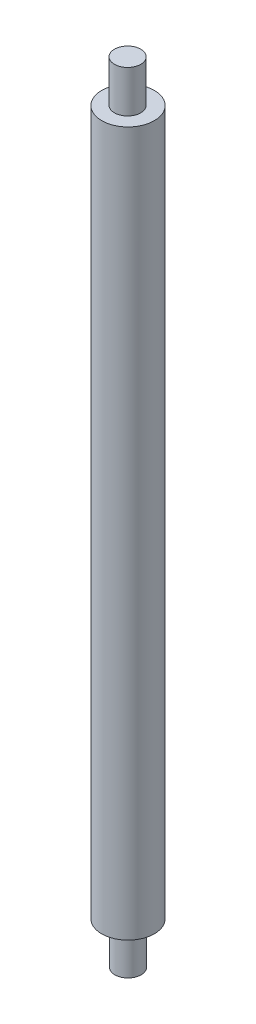
ISO-10303-21;
HEADER;
FILE_DESCRIPTION(('STEP AP214'),'2;1');
FILE_NAME('part.step','',(''),(''),'','','');
FILE_SCHEMA(('AUTOMOTIVE_DESIGN { 1 0 10303 214 1 1 1 1 }'));
ENDSEC;
DATA;
#1=APPLICATION_CONTEXT('core data for automotive mechanical design processes');
#2=APPLICATION_PROTOCOL_DEFINITION('international standard','automotive_design',2000,#1);
#3=PRODUCT_CONTEXT('',#1,'mechanical');
#4=PRODUCT('Part','Part','',(#3));
#5=PRODUCT_RELATED_PRODUCT_CATEGORY('part','',(#4));
#6=PRODUCT_DEFINITION_FORMATION('','',#4);
#7=PRODUCT_DEFINITION_CONTEXT('part definition',#1,'design');
#8=PRODUCT_DEFINITION('design','',#6,#7);
#9=PRODUCT_DEFINITION_SHAPE('','',#8);
#10=(LENGTH_UNIT() NAMED_UNIT(*) SI_UNIT(.MILLI.,.METRE.));
#11=(NAMED_UNIT(*) PLANE_ANGLE_UNIT() SI_UNIT($,.RADIAN.));
#12=(NAMED_UNIT(*) SI_UNIT($,.STERADIAN.) SOLID_ANGLE_UNIT());
#13=UNCERTAINTY_MEASURE_WITH_UNIT(LENGTH_MEASURE(1.E-05),#10,'distance_accuracy_value','');
#14=(GEOMETRIC_REPRESENTATION_CONTEXT(3) GLOBAL_UNCERTAINTY_ASSIGNED_CONTEXT((#13)) GLOBAL_UNIT_ASSIGNED_CONTEXT((#10,
#11,#12)) REPRESENTATION_CONTEXT('',''));
#15=CARTESIAN_POINT('',(0.,0.,0.));
#16=DIRECTION('',(0.,0.,1.));
#17=DIRECTION('',(1.,0.,0.));
#18=AXIS2_PLACEMENT_3D('',#15,#16,#17);
#19=CARTESIAN_POINT('',(0.,190.5,0.));
#20=DIRECTION('',(0.,-1.,0.));
#21=DIRECTION('',(0.,0.,-1.));
#22=AXIS2_PLACEMENT_3D('',#19,#20,#21);
#23=CYLINDRICAL_SURFACE('',#22,6.35);
#24=CARTESIAN_POINT('',(0.,180.34,0.));
#25=DIRECTION('',(0.,1.,0.));
#26=DIRECTION('',(0.,0.,1.));
#27=AXIS2_PLACEMENT_3D('',#24,#25,#26);
#28=CIRCLE('',#27,6.35);
#29=CARTESIAN_POINT('',(0.,180.34,6.35));
#30=VERTEX_POINT('',#29);
#31=EDGE_CURVE('E10',#30,#30,#28,.T.);
#32=ORIENTED_EDGE('',*,*,#31,.F.);
#33=EDGE_LOOP('',(#32));
#34=FACE_BOUND('',#33,.T.);
#35=CARTESIAN_POINT('',(0.,10.16,0.));
#36=DIRECTION('',(0.,-1.,0.));
#37=DIRECTION('',(0.,0.,-1.));
#38=AXIS2_PLACEMENT_3D('',#35,#36,#37);
#39=CIRCLE('',#38,6.35);
#40=CARTESIAN_POINT('',(0.,10.16,-6.35));
#41=VERTEX_POINT('',#40);
#42=EDGE_CURVE('E48',#41,#41,#39,.T.);
#43=ORIENTED_EDGE('',*,*,#42,.F.);
#44=EDGE_LOOP('',(#43));
#45=FACE_BOUND('',#44,.T.);
#46=ADVANCED_FACE('F33',(#34,#45),#23,.T.);
#47=CARTESIAN_POINT('',(0.,180.34,0.));
#48=DIRECTION('',(0.,1.,0.));
#49=DIRECTION('',(0.,0.,1.));
#50=AXIS2_PLACEMENT_3D('',#47,#48,#49);
#51=PLANE('',#50);
#52=CARTESIAN_POINT('',(-0.0990523146016629,180.34,0.));
#53=DIRECTION('',(0.,1.,0.));
#54=DIRECTION('',(0.,0.,1.));
#55=AXIS2_PLACEMENT_3D('',#52,#53,#54);
#56=CIRCLE('',#55,3.175);
#57=CARTESIAN_POINT('',(-0.0990523146016629,180.34,3.175));
#58=VERTEX_POINT('',#57);
#59=EDGE_CURVE('E39',#58,#58,#56,.T.);
#60=ORIENTED_EDGE('',*,*,#59,.F.);
#61=EDGE_LOOP('',(#60));
#62=FACE_BOUND('',#61,.T.);
#63=ORIENTED_EDGE('',*,*,#31,.T.);
#64=EDGE_LOOP('',(#63));
#65=FACE_BOUND('',#64,.T.);
#66=ADVANCED_FACE('F70',(#62,#65),#51,.T.);
#67=CARTESIAN_POINT('',(-0.0990523146016629,180.34,0.));
#68=DIRECTION('',(0.,1.,0.));
#69=DIRECTION('',(0.,0.,1.));
#70=AXIS2_PLACEMENT_3D('',#67,#68,#69);
#71=CYLINDRICAL_SURFACE('',#70,3.175);
#72=ORIENTED_EDGE('',*,*,#59,.T.);
#73=EDGE_LOOP('',(#72));
#74=FACE_BOUND('',#73,.T.);
#75=CARTESIAN_POINT('',(-0.0990523146016629,190.5,0.));
#76=DIRECTION('',(0.,1.,0.));
#77=DIRECTION('',(0.,0.,1.));
#78=AXIS2_PLACEMENT_3D('',#75,#76,#77);
#79=CIRCLE('',#78,3.175);
#80=CARTESIAN_POINT('',(-0.0990523146016629,190.5,3.175));
#81=VERTEX_POINT('',#80);
#82=EDGE_CURVE('E43',#81,#81,#79,.T.);
#83=ORIENTED_EDGE('',*,*,#82,.F.);
#84=EDGE_LOOP('',(#83));
#85=FACE_BOUND('',#84,.T.);
#86=ADVANCED_FACE('F75',(#74,#85),#71,.T.);
#87=CARTESIAN_POINT('',(0.,190.5,0.));
#88=DIRECTION('',(0.,1.,0.));
#89=DIRECTION('',(0.,0.,1.));
#90=AXIS2_PLACEMENT_3D('',#87,#88,#89);
#91=PLANE('',#90);
#92=ORIENTED_EDGE('',*,*,#82,.T.);
#93=EDGE_LOOP('',(#92));
#94=FACE_BOUND('',#93,.T.);
#95=ADVANCED_FACE('F65',(#94),#91,.T.);
#96=CARTESIAN_POINT('',(0.,10.16,0.));
#97=DIRECTION('',(0.,-1.,0.));
#98=DIRECTION('',(0.,0.,-1.));
#99=AXIS2_PLACEMENT_3D('',#96,#97,#98);
#100=PLANE('',#99);
#101=CARTESIAN_POINT('',(0.,10.16,0.));
#102=DIRECTION('',(0.,-1.,0.));
#103=DIRECTION('',(0.,0.,-1.));
#104=AXIS2_PLACEMENT_3D('',#101,#102,#103);
#105=CIRCLE('',#104,3.175);
#106=CARTESIAN_POINT('',(0.,10.16,-3.175));
#107=VERTEX_POINT('',#106);
#108=EDGE_CURVE('E52',#107,#107,#105,.T.);
#109=ORIENTED_EDGE('',*,*,#108,.F.);
#110=EDGE_LOOP('',(#109));
#111=FACE_BOUND('',#110,.T.);
#112=ORIENTED_EDGE('',*,*,#42,.T.);
#113=EDGE_LOOP('',(#112));
#114=FACE_BOUND('',#113,.T.);
#115=ADVANCED_FACE('F62',(#111,#114),#100,.T.);
#116=CARTESIAN_POINT('',(0.,10.16,0.));
#117=DIRECTION('',(0.,-1.,0.));
#118=DIRECTION('',(0.,0.,-1.));
#119=AXIS2_PLACEMENT_3D('',#116,#117,#118);
#120=CYLINDRICAL_SURFACE('',#119,3.175);
#121=ORIENTED_EDGE('',*,*,#108,.T.);
#122=EDGE_LOOP('',(#121));
#123=FACE_BOUND('',#122,.T.);
#124=CARTESIAN_POINT('',(0.,0.,0.));
#125=DIRECTION('',(0.,-1.,0.));
#126=DIRECTION('',(0.,0.,-1.));
#127=AXIS2_PLACEMENT_3D('',#124,#125,#126);
#128=CIRCLE('',#127,3.175);
#129=CARTESIAN_POINT('',(0.,0.,-3.175));
#130=VERTEX_POINT('',#129);
#131=EDGE_CURVE('E53',#130,#130,#128,.T.);
#132=ORIENTED_EDGE('',*,*,#131,.F.);
#133=EDGE_LOOP('',(#132));
#134=FACE_BOUND('',#133,.T.);
#135=ADVANCED_FACE('F59',(#123,#134),#120,.T.);
#136=CARTESIAN_POINT('',(0.,0.,0.));
#137=DIRECTION('',(0.,1.,0.));
#138=DIRECTION('',(0.,0.,1.));
#139=AXIS2_PLACEMENT_3D('',#136,#137,#138);
#140=PLANE('',#139);
#141=ORIENTED_EDGE('',*,*,#131,.T.);
#142=EDGE_LOOP('',(#141));
#143=FACE_BOUND('',#142,.T.);
#144=ADVANCED_FACE('F85',(#143),#140,.F.);
#145=CLOSED_SHELL('',(#46,#66,#86,#95,#115,#135,#144));
#146=MANIFOLD_SOLID_BREP('B2',#145);
#147=ADVANCED_BREP_SHAPE_REPRESENTATION('',(#18,#146),#14);
#148=SHAPE_DEFINITION_REPRESENTATION(#9,#147);
ENDSEC;
END-ISO-10303-21;
